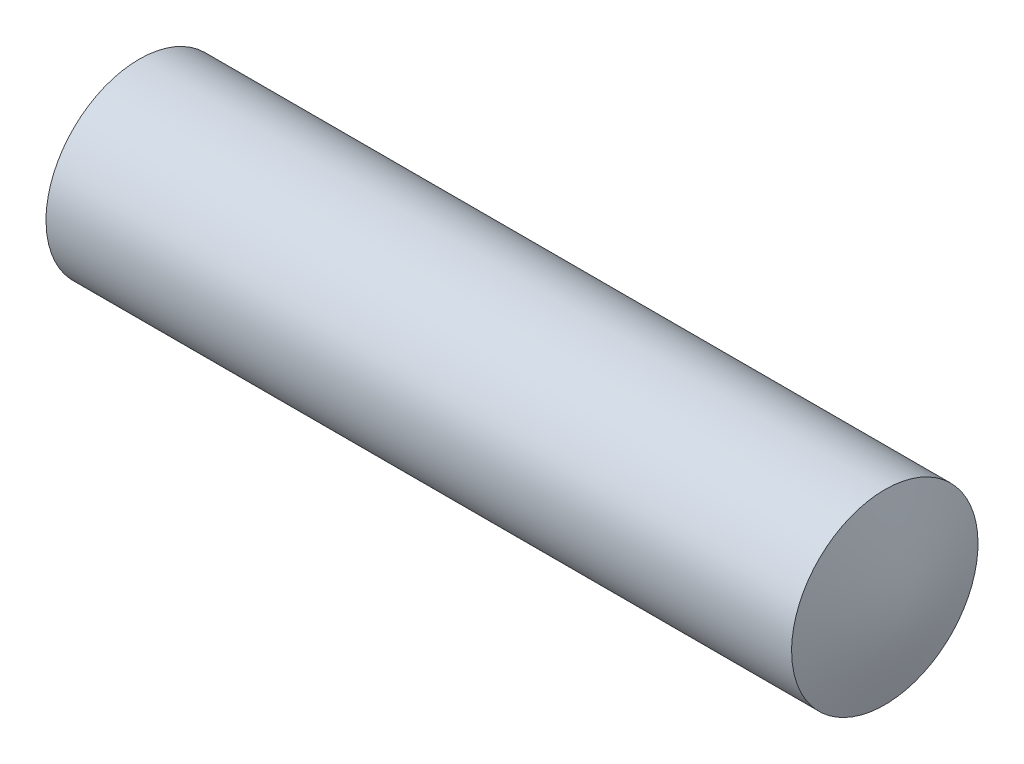
ISO-10303-21;
HEADER;
FILE_DESCRIPTION(('STEP AP214'),'2;1');
FILE_NAME('part.step','',(''),(''),'','','');
FILE_SCHEMA(('AUTOMOTIVE_DESIGN { 1 0 10303 214 1 1 1 1 }'));
ENDSEC;
DATA;
#1=APPLICATION_CONTEXT('core data for automotive mechanical design processes');
#2=APPLICATION_PROTOCOL_DEFINITION('international standard','automotive_design',2000,#1);
#3=PRODUCT_CONTEXT('',#1,'mechanical');
#4=PRODUCT('Part','Part','',(#3));
#5=PRODUCT_RELATED_PRODUCT_CATEGORY('part','',(#4));
#6=PRODUCT_DEFINITION_FORMATION('','',#4);
#7=PRODUCT_DEFINITION_CONTEXT('part definition',#1,'design');
#8=PRODUCT_DEFINITION('design','',#6,#7);
#9=PRODUCT_DEFINITION_SHAPE('','',#8);
#10=(LENGTH_UNIT() NAMED_UNIT(*) SI_UNIT(.MILLI.,.METRE.));
#11=(NAMED_UNIT(*) PLANE_ANGLE_UNIT() SI_UNIT($,.RADIAN.));
#12=(NAMED_UNIT(*) SI_UNIT($,.STERADIAN.) SOLID_ANGLE_UNIT());
#13=UNCERTAINTY_MEASURE_WITH_UNIT(LENGTH_MEASURE(1.E-05),#10,'distance_accuracy_value','');
#14=(GEOMETRIC_REPRESENTATION_CONTEXT(3) GLOBAL_UNCERTAINTY_ASSIGNED_CONTEXT((#13)) GLOBAL_UNIT_ASSIGNED_CONTEXT((#10,
#11,#12)) REPRESENTATION_CONTEXT('',''));
#15=CARTESIAN_POINT('',(0.,0.,0.));
#16=DIRECTION('',(0.,0.,1.));
#17=DIRECTION('',(1.,0.,0.));
#18=AXIS2_PLACEMENT_3D('',#15,#16,#17);
#19=CARTESIAN_POINT('',(12.,0.,0.));
#20=DIRECTION('',(-1.,0.,0.));
#21=DIRECTION('',(0.,0.,1.));
#22=AXIS2_PLACEMENT_3D('',#19,#20,#21);
#23=CYLINDRICAL_SURFACE('',#22,1.5);
#24=CARTESIAN_POINT('',(12.0001059827185,-2.3166701931104E-11,1.5));
#25=CARTESIAN_POINT('',(12.0001064318825,-0.0842556552579519,1.49999626375808));
#26=CARTESIAN_POINT('',(12.0001200074263,-0.168572402661575,1.49287716431795));
#27=CARTESIAN_POINT('',(12.000118282324,-0.334883759961265,1.46457645679987));
#28=CARTESIAN_POINT('',(12.000102946884,-0.416875451132306,1.44337792419635));
#29=CARTESIAN_POINT('',(12.0001029470895,-0.576103212730483,1.3875218228483));
#30=CARTESIAN_POINT('',(12.0001182681021,-0.653341533891657,1.35287068164928));
#31=CARTESIAN_POINT('',(12.0001545482061,-0.80088277753454,1.27110181285513));
#32=CARTESIAN_POINT('',(12.0001755058955,-0.871187418606728,1.22398718519003));
#33=CARTESIAN_POINT('',(12.0001969373426,-1.00289772294532,1.11861924402725));
#34=CARTESIAN_POINT('',(12.0001974089591,-1.06430245539378,1.06036476691778));
#35=CARTESIAN_POINT('',(12.0001785401791,-1.17646253414243,0.934371371444682));
#36=CARTESIAN_POINT('',(12.0001591990045,-1.22721746213628,0.866632080707747));
#37=CARTESIAN_POINT('',(12.0001197457205,-1.3166334185829,0.723595166156088));
#38=CARTESIAN_POINT('',(12.0000996336258,-1.35529467633867,0.648297685684775));
#39=CARTESIAN_POINT('',(12.0001022446447,-1.41942700099795,0.492280945238238));
#40=CARTESIAN_POINT('',(12.0001249676721,-1.44489809444491,0.411561696173971));
#41=CARTESIAN_POINT('',(12.0001511753142,-1.48192720558279,0.246992525677086));
#42=CARTESIAN_POINT('',(12.0001546598979,-1.4934852007852,0.16314259918441));
#43=CARTESIAN_POINT('',(12.0001602554544,-1.50235993023339,-0.00530739730532846));
#44=CARTESIAN_POINT('',(12.0001623664297,-1.49967669016667,-0.0899074659490521));
#45=CARTESIAN_POINT('',(12.000145445424,-1.48014517100489,-0.257456429244504));
#46=CARTESIAN_POINT('',(12.0001264134243,-1.46329687936906,-0.340405322434325));
#47=CARTESIAN_POINT('',(12.0001038153048,-1.41591348629939,-0.502297276486188));
#48=CARTESIAN_POINT('',(12.0001002492012,-1.38537837055217,-0.581240333158914));
#49=CARTESIAN_POINT('',(12.0001217344683,-1.31148814889508,-0.732879515365011));
#50=CARTESIAN_POINT('',(12.0001467858252,-1.26813304914022,-0.805575643897577));
#51=CARTESIAN_POINT('',(12.0001838811954,-1.16983359433255,-0.942657362687674));
#52=CARTESIAN_POINT('',(12.0001959252141,-1.11488924406226,-1.00704295637468));
#53=CARTESIAN_POINT('',(12.0001980967556,-0.994970956685746,-1.12567594992769));
#54=CARTESIAN_POINT('',(12.0001882242685,-0.929997015000458,-1.17992334516502));
#55=CARTESIAN_POINT('',(12.0001534759152,-0.79186397468898,-1.27673998793248));
#56=CARTESIAN_POINT('',(12.0001286000467,-0.71870487484212,-1.31930923372102));
#57=CARTESIAN_POINT('',(12.0001045506413,-0.56627829962824,-1.39156115073635));
#58=CARTESIAN_POINT('',(12.0001053771015,-0.487010824954788,-1.42124382342633));
#59=CARTESIAN_POINT('',(12.0001103293267,-0.324617669968242,-1.46687999424995));
#60=CARTESIAN_POINT('',(12.0001144550916,-0.241491989817691,-1.482833492962));
#61=CARTESIAN_POINT('',(12.0001135510741,-0.0737421166618076,-1.50055844543833));
#62=CARTESIAN_POINT('',(12.0001085212922,0.0108820762611361,-1.50232989998235));
#63=CARTESIAN_POINT('',(12.0001101307981,0.179226752009532,-1.49164047953271));
#64=CARTESIAN_POINT('',(12.0001167700864,0.262947234795836,-1.47917960392251));
#65=CARTESIAN_POINT('',(12.0001125627333,0.427107928078044,-1.44037924497763));
#66=CARTESIAN_POINT('',(12.0001017160883,0.507548137872126,-1.4140397586736));
#67=CARTESIAN_POINT('',(12.0001148007699,0.662864792137111,-1.34822988299196));
#68=CARTESIAN_POINT('',(12.0001387320922,0.737741237315941,-1.3087594952851));
#69=CARTESIAN_POINT('',(12.0001768194986,0.879804823885455,-1.21780828332126));
#70=CARTESIAN_POINT('',(12.0001909755873,0.946991968809414,-1.16632746458316));
#71=CARTESIAN_POINT('',(12.000197255257,1.07176977584983,-1.05281674395769));
#72=CARTESIAN_POINT('',(12.0001893788293,1.12936043414568,-0.990786837870475));
#73=CARTESIAN_POINT('',(12.00015788586,1.23331040664297,-0.857938803777591));
#74=CARTESIAN_POINT('',(12.0001342693176,1.27966972022704,-0.787120675288845));
#75=CARTESIAN_POINT('',(12.0001037479245,1.35984095676549,-0.638706588457513));
#76=CARTESIAN_POINT('',(12.000096843056,1.39365289308153,-0.561110637332718));
#77=CARTESIAN_POINT('',(12.0001158426938,1.44776961558461,-0.401343583524262));
#78=CARTESIAN_POINT('',(12.0001417471919,1.46807440512229,-0.319172481975533));
#79=CARTESIAN_POINT('',(12.0001628973597,1.49460048101546,-0.152587540757091));
#80=CARTESIAN_POINT('',(12.0001581429741,1.50082174194889,-0.0681736970392977));
#81=CARTESIAN_POINT('',(12.0001555195963,1.49900408584573,0.100500201589055));
#82=CARTESIAN_POINT('',(12.0001576505944,1.49096518871357,0.184760256714109));
#83=CARTESIAN_POINT('',(12.0001341263468,1.46085541218667,0.350734972117025));
#84=CARTESIAN_POINT('',(12.0001084710453,1.43878450462693,0.432449627285426));
#85=CARTESIAN_POINT('',(12.0000968828057,1.38123672474372,0.591015206454616));
#86=CARTESIAN_POINT('',(12.0001109506081,1.34575960251996,0.66786603975952));
#87=CARTESIAN_POINT('',(12.0001474881132,1.26240798891117,0.814517788750713));
#88=CARTESIAN_POINT('',(12.0001699574859,1.21453398420443,0.884318981043152));
#89=CARTESIAN_POINT('',(12.0001964494271,1.1077533190652,1.01488655840472));
#90=CARTESIAN_POINT('',(12.0002004739316,1.04884781723405,1.07565389106881));
#91=CARTESIAN_POINT('',(12.0001871038097,0.921653810424114,1.18645206030826));
#92=CARTESIAN_POINT('',(12.0001697038592,0.853362976937675,1.23648022457207));
#93=CARTESIAN_POINT('',(12.0001304961946,0.709324979348611,1.32438024721834));
#94=CARTESIAN_POINT('',(12.0001086863811,0.633574272685011,1.36224629329984));
#95=CARTESIAN_POINT('',(12.0001005727564,0.476850261871239,1.42467985961517));
#96=CARTESIAN_POINT('',(12.0001142262696,0.395883349123361,1.44926332070846));
#97=CARTESIAN_POINT('',(12.0001194844647,0.262000371009961,1.47788194284121));
#98=CARTESIAN_POINT('',(12.0001174385281,0.209954240899939,1.48616586272016));
#99=CARTESIAN_POINT('',(12.0001105473122,0.105280026193528,1.49722605870921));
#100=CARTESIAN_POINT('',(12.0001057020329,0.052651941595459,1.50000233480341));
#101=CARTESIAN_POINT('',(12.0001059827185,-2.3166701931104E-11,1.5));
#102=B_SPLINE_CURVE_WITH_KNOTS('',3,(#24,#25,#26,#27,#28,#29,#30,#31,#32,#33,#34,#35,#36,#37,
#38,#39,#40,#41,#42,#43,#44,#45,#46,#47,#48,#49,#50,#51,#52,#53,#54,#55,#56,#57,#58,#59,#60,#61,
#62,#63,#64,#65,#66,#67,#68,#69,#70,#71,#72,#73,#74,#75,#76,#77,#78,#79,#80,#81,#82,#83,#84,#85,
#86,#87,#88,#89,#90,#91,#92,#93,#94,#95,#96,#97,#98,#99,#100,#101),.UNSPECIFIED.,.T.,.F.,(4,2,2,
2,2,2,2,2,2,2,2,2,2,2,2,2,2,2,2,2,2,2,2,2,2,2,2,2,2,2,2,2,2,2,2,2,2,2,4),(0.,0.252574786765832,
0.505453738045248,0.758212014248185,1.01090748318773,1.26362936183785,1.51636116511979,
1.76908817617,2.02181467863882,2.27454158960286,2.52726804471296,2.77999472357024,
3.03272166672437,3.28544848854183,3.53817520606716,3.79090203897654,4.04362890957565,
4.29635575147925,4.54908258273567,4.80180940009704,5.05453622840629,5.30726311078679,
5.55998996101064,5.81271669510469,6.06544352981549,6.31817037841832,6.57089695789241,
6.82362347467433,7.0763504476506,7.32907706786904,7.58180419536082,7.83453603407801,
8.08725795252233,8.33995334329718,8.59271154154484,8.84559035433524,9.09816500114989,
9.25600073160299,9.41383646251119),.UNSPECIFIED.);
#103=CARTESIAN_POINT('',(12.0001059827185,-2.3166701931104E-11,1.5));
#104=VERTEX_POINT('',#103);
#105=EDGE_CURVE('E12',#104,#104,#102,.T.);
#106=ORIENTED_EDGE('',*,*,#105,.F.);
#107=EDGE_LOOP('',(#106));
#108=FACE_BOUND('',#107,.T.);
#109=CARTESIAN_POINT('',(-0.000105982718356098,2.32235981815125E-11,1.5));
#110=CARTESIAN_POINT('',(-0.000106468263381592,-0.0842556549268096,1.4999962637602));
#111=CARTESIAN_POINT('',(-0.000120080340289708,-0.168572402047688,1.49287716436775));
#112=CARTESIAN_POINT('',(-0.000118187904624471,-0.334883758747322,1.46457645706123));
#113=CARTESIAN_POINT('',(-0.000102648308513269,-0.416875449601755,1.44337792462591));
#114=CARTESIAN_POINT('',(-0.000102299074379299,-0.576103210735653,1.38752182365533));
#115=CARTESIAN_POINT('',(-0.000117474775423849,-0.653341531746734,1.35287068265883));
#116=CARTESIAN_POINT('',(-0.000154078931020456,-0.8008827750548,1.2711018144086));
#117=CARTESIAN_POINT('',(-0.000175505830910784,-0.871187415935465,1.22398718707254));
#118=CARTESIAN_POINT('',(-0.000198506643627144,-1.00289771968125,1.118619246893));
#119=CARTESIAN_POINT('',(-0.000200078481468176,-1.06430245178432,1.06036477050758));
#120=CARTESIAN_POINT('',(-0.000182736204225892,-1.17646253014771,0.934371376396956));
#121=CARTESIAN_POINT('',(-0.000163821284633403,-1.2272174580998,0.866632086296767));
#122=CARTESIAN_POINT('',(-0.000123442163210537,-1.31663341293057,0.723595176066043));
#123=CARTESIAN_POINT('',(-0.000101978009812821,-1.3552946695251,0.648297699537011));
#124=CARTESIAN_POINT('',(-0.000101585815278593,-1.41942699331552,0.492280966650883));
#125=CARTESIAN_POINT('',(-0.000122657688479701,-1.44489808707465,0.411561721212887));
#126=CARTESIAN_POINT('',(-0.000148001592430528,-1.48192720074581,0.246992554890972));
#127=CARTESIAN_POINT('',(-0.000152273595290303,-1.49348519756029,0.163142628809954));
#128=CARTESIAN_POINT('',(-0.000160266043991163,-1.50235993031765,-0.00530736731863429));
#129=CARTESIAN_POINT('',(-0.000163986490827387,-1.49967669195547,-0.0899074360124757));
#130=CARTESIAN_POINT('',(-0.000148492246194484,-1.48014517567577,-0.257456403767534));
#131=CARTESIAN_POINT('',(-0.000129277533284224,-1.46329688451593,-0.340405301285065));
#132=CARTESIAN_POINT('',(-0.000104576280820206,-1.41591349109031,-0.502297263681561));
#133=CARTESIAN_POINT('',(-9.90897556217931E-05,-1.38537837451247,-0.581240324371601));
#134=CARTESIAN_POINT('',(-0.0001179702619388,-1.31148815123953,-0.732879511213532));
#135=CARTESIAN_POINT('',(-0.000142337277875911,-1.26813305123423,-0.805575640625202));
#136=CARTESIAN_POINT('',(-0.000179633850063402,-1.16983359594662,-0.942657360789015));
#137=CARTESIAN_POINT('',(-0.000192563411011391,-1.11488924542429,-1.00704295495446));
#138=CARTESIAN_POINT('',(-0.000196564722241278,-0.994970956251304,-1.12567595043026));
#139=CARTESIAN_POINT('',(-0.000187636462237958,-0.929997012881225,-1.17992334697006));
#140=CARTESIAN_POINT('',(-0.000154014983182949,-0.79186396894335,-1.27673999163987));
#141=CARTESIAN_POINT('',(-0.000129321761784695,-0.718704867157221,-1.31930923803163));
#142=CARTESIAN_POINT('',(-0.000105214807539199,-0.566278291108545,-1.39156115410691));
#143=CARTESIAN_POINT('',(-0.000105801070775193,-0.487010817792422,-1.42124382578705));
#144=CARTESIAN_POINT('',(-0.000110397806314821,-0.324617665732364,-1.46687999509239));
#145=CARTESIAN_POINT('',(-0.000114408278472426,-0.241491987152966,-1.48283349330308));
#146=CARTESIAN_POINT('',(-0.000113481777298522,-0.0737421151617547,-1.50055844553731));
#147=CARTESIAN_POINT('',(-0.000108544804240272,0.0108820782042934,-1.50232989999397));
#148=CARTESIAN_POINT('',(-0.000110203855266434,0.179226754828229,-1.49164047921873));
#149=CARTESIAN_POINT('',(-0.000116799879852461,0.26294723804681,-1.4791796033678));
#150=CARTESIAN_POINT('',(-0.000112295041968568,0.42710793144938,-1.44037924396712));
#151=CARTESIAN_POINT('',(-0.000101194175853733,0.507548140957748,-1.41403975755888));
#152=CARTESIAN_POINT('',(-0.000114050129919581,0.662864794700197,-1.34822988171325));
#153=CARTESIAN_POINT('',(-0.00013800694564823,0.737741239640827,-1.30875949394337));
#154=CARTESIAN_POINT('',(-0.000176890548983523,0.879804824555615,-1.21780828274552));
#155=CARTESIAN_POINT('',(-0.000191817340870576,0.946991968174642,-1.16632746501073));
#156=CARTESIAN_POINT('',(-0.000199921502309663,1.07176977312238,-1.05281674658874));
#157=CARTESIAN_POINT('',(-0.000193098863237337,1.12936043064576,-0.99078684171848));
#158=CARTESIAN_POINT('',(-0.000162444198260389,1.23331040281906,-0.85793880928945));
#159=CARTESIAN_POINT('',(-0.000138612171109801,1.27966971664627,-0.787120681086928));
#160=CARTESIAN_POINT('',(-0.000106056757608647,1.3598409537508,-0.638706594869047));
#161=CARTESIAN_POINT('',(-9.73333551710558E-05,1.39365289038801,-0.561110644070521));
#162=CARTESIAN_POINT('',(-0.000113655183064332,1.44776961482804,-0.401343586972039));
#163=CARTESIAN_POINT('',(-0.000138700406483567,1.46807440539545,-0.319172481608511));
#164=CARTESIAN_POINT('',(-0.00016040430560108,1.49460048205367,-0.152587532888649));
#165=CARTESIAN_POINT('',(-0.00015706293002785,1.50082174270698,-0.0681736854817774));
#166=CARTESIAN_POINT('',(-0.000157099314650237,1.4990040847689,0.100500219608717));
#167=CARTESIAN_POINT('',(-0.000160477065383372,1.49096518625995,0.184760277508753));
#168=CARTESIAN_POINT('',(-0.000137025182041497,1.46085540623142,0.350734997674787));
#169=CARTESIAN_POINT('',(-0.000110195487305441,1.43878449653351,0.432449654828904));
#170=CARTESIAN_POINT('',(-9.5738090012295E-05,1.38123671283647,0.591015234020324));
#171=CARTESIAN_POINT('',(-0.000108111116311,1.34575958960022,0.667866065602437));
#172=CARTESIAN_POINT('',(-0.000142970593673964,1.26240797456327,0.814517810883615));
#173=CARTESIAN_POINT('',(-0.000165456647748383,1.21453396943706,0.884319001186696));
#174=CARTESIAN_POINT('',(-0.000193061307851953,1.10775330541367,1.01488657301091));
#175=CARTESIAN_POINT('',(-0.000198181737093082,1.04884780539525,1.07565390235394));
#176=CARTESIAN_POINT('',(-0.000186578249050967,0.92165380293675,1.18645206585799));
#177=CARTESIAN_POINT('',(-0.000169848902069495,0.853362972003452,1.23648022772409));
#178=CARTESIAN_POINT('',(-0.000131271626740529,0.709324977896895,1.32438024796324));
#179=CARTESIAN_POINT('',(-0.000109421259475111,0.633574271909551,1.36224629361982));
#180=CARTESIAN_POINT('',(-0.000101027812033379,0.476850262465812,1.42467985936727));
#181=CARTESIAN_POINT('',(-0.000114442295408107,0.395883350410151,1.44926332031352));
#182=CARTESIAN_POINT('',(-0.000119491229753124,0.262000372705749,1.47788194255379));
#183=CARTESIAN_POINT('',(-0.000117407867763461,0.209954242276801,1.48616586253776));
#184=CARTESIAN_POINT('',(-0.00011050190184536,0.105280026914708,1.49722605866993));
#185=CARTESIAN_POINT('',(-0.000105679297908951,0.0526519419798703,1.50000233480211));
#186=CARTESIAN_POINT('',(-0.000105982718356098,2.32235981815125E-11,1.5));
#187=B_SPLINE_CURVE_WITH_KNOTS('',3,(#109,#110,#111,#112,#113,#114,#115,#116,#117,#118,#119,
#120,#121,#122,#123,#124,#125,#126,#127,#128,#129,#130,#131,#132,#133,#134,#135,#136,#137,#138,
#139,#140,#141,#142,#143,#144,#145,#146,#147,#148,#149,#150,#151,#152,#153,#154,#155,#156,#157,
#158,#159,#160,#161,#162,#163,#164,#165,#166,#167,#168,#169,#170,#171,#172,#173,#174,#175,#176,
#177,#178,#179,#180,#181,#182,#183,#184,#185,#186),.UNSPECIFIED.,.T.,.F.,(4,2,2,2,2,2,2,2,2,2,2,
2,2,2,2,2,2,2,2,2,2,2,2,2,2,2,2,2,2,2,2,2,2,2,2,2,2,2,4),(0.,0.252574785900327,
0.505453736238522,0.758212011627218,1.01090748000226,1.26362935650273,1.51636115767969,
1.76908815799607,2.02181464935155,2.27454156026531,2.52726801519358,2.77999470638553,
3.03272166184961,3.28544848543463,3.53817520521927,3.79090204392472,4.04362892024775,
4.29635575741368,4.54908258380187,4.80180940247165,5.05453623213346,5.30726311384781,
5.55998996346796,5.81271669329047,6.06544352332739,6.31817037187698,6.57089695133352,
6.82362347906298,7.0763504632639,7.32907709155208,7.58180422735384,7.83453606187838,
8.08725797620723,8.33995335651314,8.59271154390391,8.84559035446139,9.0981649991177,
9.2560007305724,9.41383646248645),.UNSPECIFIED.);
#188=CARTESIAN_POINT('',(-0.000105982718356098,2.32235981815125E-11,1.5));
#189=VERTEX_POINT('',#188);
#190=EDGE_CURVE('E137',#189,#189,#187,.T.);
#191=ORIENTED_EDGE('',*,*,#190,.T.);
#192=EDGE_LOOP('',(#191));
#193=FACE_BOUND('',#192,.T.);
#194=ADVANCED_FACE('F123',(#108,#193),#23,.T.);
#195=CARTESIAN_POINT('',(11.8033901567117,-1.52998606169543,-1.59548793655052));
#196=CARTESIAN_POINT('',(11.8507874924583,-1.52998606169543,-1.34021049039008));
#197=CARTESIAN_POINT('',(11.8939065515164,-1.52998606169543,-1.08493304422964));
#198=CARTESIAN_POINT('',(11.9340998152935,-1.52998606169543,-0.8296555980692));
#199=CARTESIAN_POINT('',(11.9801912396677,-1.52998606169543,-0.446738909147258));
#200=CARTESIAN_POINT('',(11.9929240980353,-1.52998606169543,-0.0638222202253154));
#201=CARTESIAN_POINT('',(11.9929256141974,-1.52998606169544,0.0638170225361882));
#202=CARTESIAN_POINT('',(11.9801995088577,-1.52998606169544,0.446734750820699));
#203=CARTESIAN_POINT('',(11.9340950420421,-1.52998606169543,0.82965247910521));
#204=CARTESIAN_POINT('',(11.8938926453803,-1.52998606169543,1.08493096462822));
#205=CARTESIAN_POINT('',(11.8507784312655,-1.52998606169543,1.34020945015122));
#206=CARTESIAN_POINT('',(11.8033846085844,-1.52998606169543,1.59548793567423));
#207=CARTESIAN_POINT('',(11.845755523366,-1.2851888898442,-1.59548793655052));
#208=CARTESIAN_POINT('',(11.9006092808553,-1.2851888898442,-1.34021049039008));
#209=CARTESIAN_POINT('',(11.9511217303888,-1.2851888898442,-1.08493304422964));
#210=CARTESIAN_POINT('',(11.9990209182289,-1.2851888898442,-0.8296555980692));
#211=CARTESIAN_POINT('',(12.0542978970554,-1.2851888898442,-0.446738909147258));
#212=CARTESIAN_POINT('',(12.0696007200402,-1.2851888898442,-0.0638222202253153));
#213=CARTESIAN_POINT('',(12.0696013072204,-1.2851888898442,0.0638170225361883));
#214=CARTESIAN_POINT('',(12.0543017530439,-1.2851888898442,0.446734750820699));
#215=CARTESIAN_POINT('',(11.9990122008694,-1.2851888898442,0.82965247910521));
#216=CARTESIAN_POINT('',(11.9511145554032,-1.2851888898442,1.08493096462822));
#217=CARTESIAN_POINT('',(11.9006061461928,-1.2851888898442,1.34020945015122));
#218=CARTESIAN_POINT('',(11.845755553712,-1.2851888898442,1.59548793567423));
#219=CARTESIAN_POINT('',(11.884193504468,-1.04039171799296,-1.59548793655052));
#220=CARTESIAN_POINT('',(11.9464440338911,-1.04039171799296,-1.34021049039008));
#221=CARTESIAN_POINT('',(12.0042280361642,-1.04039171799296,-1.08493304422964));
#222=CARTESIAN_POINT('',(12.0601048088876,-1.04039171799296,-0.8296555980692));
#223=CARTESIAN_POINT('',(12.1248639649365,-1.04039171799296,-0.446738909147258));
#224=CARTESIAN_POINT('',(12.1428225327074,-1.04039171799296,-0.0638222202253153));
#225=CARTESIAN_POINT('',(12.1428230826577,-1.04039171799296,0.0638170225361883));
#226=CARTESIAN_POINT('',(12.1248613441893,-1.04039171799296,0.446734750820699));
#227=CARTESIAN_POINT('',(12.0600968685364,-1.04039171799296,0.82965247910521));
#228=CARTESIAN_POINT('',(12.0042311933115,-1.04039171799296,1.08493096462822));
#229=CARTESIAN_POINT('',(11.9464457216828,-1.04039171799296,1.34020945015122));
#230=CARTESIAN_POINT('',(11.8841975747089,-1.04039171799296,1.59548793567423));
#231=CARTESIAN_POINT('',(11.9199001165165,-0.79559454614172,-1.59548793655052));
#232=CARTESIAN_POINT('',(11.9898792798668,-0.79559454614172,-1.34021049039008));
#233=CARTESIAN_POINT('',(12.0556175098634,-0.79559454614172,-1.08493304422964));
#234=CARTESIAN_POINT('',(12.1201842309555,-0.79559454614172,-0.8296555980692));
#235=CARTESIAN_POINT('',(12.1938571551987,-0.795594546141721,-0.446738909147258));
#236=CARTESIAN_POINT('',(12.2145234211836,-0.795594546141721,-0.0638222202253153));
#237=CARTESIAN_POINT('',(12.2145231487078,-0.795594546141721,0.0638170225361883));
#238=CARTESIAN_POINT('',(12.1938558890335,-0.795594546141721,0.446734750820699));
#239=CARTESIAN_POINT('',(12.1201864818886,-0.79559454614172,0.82965247910521));
#240=CARTESIAN_POINT('',(12.0556183516298,-0.79559454614172,1.08493096462822));
#241=CARTESIAN_POINT('',(11.9898808713694,-0.79559454614172,1.34020945015122));
#242=CARTESIAN_POINT('',(11.9199021009081,-0.79559454614172,1.59548793567423));
#243=CARTESIAN_POINT('',(11.9605240175338,-0.4283982900148,-1.59548793655052));
#244=CARTESIAN_POINT('',(12.0398325367382,-0.4283982900148,-1.34021049039008));
#245=CARTESIAN_POINT('',(12.1152483085778,-0.4283982900148,-1.08493304422964));
#246=CARTESIAN_POINT('',(12.1888661639323,-0.4283982900148,-0.8296555980692));
#247=CARTESIAN_POINT('',(12.2795144311948,-0.428398290014801,-0.446738909147258));
#248=CARTESIAN_POINT('',(12.3053547203178,-0.428398290014801,-0.0638222202253153));
#249=CARTESIAN_POINT('',(12.3053548296069,-0.428398290014801,0.0638170225361883));
#250=CARTESIAN_POINT('',(12.2795155101332,-0.428398290014801,0.446734750820699));
#251=CARTESIAN_POINT('',(12.1888666803469,-0.4283982900148,0.82965247910521));
#252=CARTESIAN_POINT('',(12.1152492721626,-0.4283982900148,1.08493096462822));
#253=CARTESIAN_POINT('',(12.0398326174497,-0.4283982900148,1.34020945015122));
#254=CARTESIAN_POINT('',(11.9605238291195,-0.4283982900148,1.59548793567423));
#255=CARTESIAN_POINT('',(11.9716476972195,-0.0612020338878795,-1.59548793655052));
#256=CARTESIAN_POINT('',(12.0535906423927,-0.0612020338878797,-1.34021049039008));
#257=CARTESIAN_POINT('',(12.1317858649904,-0.0612020338878799,-1.08493304422964));
#258=CARTESIAN_POINT('',(12.208171248917,-0.0612020338878801,-0.8296555980692));
#259=CARTESIAN_POINT('',(12.3040084125708,-0.0612020338878803,-0.446738909147258));
#260=CARTESIAN_POINT('',(12.3336635831969,-0.0612020338878803,-0.0638222202253153));
#261=CARTESIAN_POINT('',(12.333663766226,-0.0612020338878803,0.0638170225361883));
#262=CARTESIAN_POINT('',(12.3040092804464,-0.0612020338878803,0.446734750820699));
#263=CARTESIAN_POINT('',(12.2081723015664,-0.0612020338878801,0.82965247910521));
#264=CARTESIAN_POINT('',(12.1317863566223,-0.0612020338878799,1.08493096462822));
#265=CARTESIAN_POINT('',(12.053590916831,-0.0612020338878797,1.34020945015122));
#266=CARTESIAN_POINT('',(11.9716475863873,-0.0612020338878795,1.59548793567423));
#267=CARTESIAN_POINT('',(11.9716476331157,0.0611970503878023,-1.59548793655052));
#268=CARTESIAN_POINT('',(12.0535906520546,0.0611970503878021,-1.34021049039008));
#269=CARTESIAN_POINT('',(12.1317858157981,0.061197050387802,-1.08493304422964));
#270=CARTESIAN_POINT('',(12.2081714540318,0.0611970503878018,-0.8296555980692));
#271=CARTESIAN_POINT('',(12.3040084611393,0.0611970503878016,-0.446738909147258));
#272=CARTESIAN_POINT('',(12.3336637586729,0.0611970503878015,-0.0638222202253153));
#273=CARTESIAN_POINT('',(12.3336639244239,0.0611970503878015,0.0638170225361883));
#274=CARTESIAN_POINT('',(12.3040094944262,0.0611970503878016,0.446734750820699));
#275=CARTESIAN_POINT('',(12.2081723079539,0.0611970503878018,0.82965247910521));
#276=CARTESIAN_POINT('',(12.1317865919873,0.061197050387802,1.08493096462822));
#277=CARTESIAN_POINT('',(12.0535910410838,0.0611970503878022,1.34020945015122));
#278=CARTESIAN_POINT('',(11.9716477460547,0.0611970503878023,1.59548793567423));
#279=CARTESIAN_POINT('',(11.9605241852634,0.428394303214848,-1.59548793655052));
#280=CARTESIAN_POINT('',(12.0398327557083,0.428394303214848,-1.34021049039008));
#281=CARTESIAN_POINT('',(12.1152492217613,0.428394303214848,-1.08493304422964));
#282=CARTESIAN_POINT('',(12.1888664024306,0.428394303214847,-0.8296555980692));
#283=CARTESIAN_POINT('',(12.2795154621096,0.428394303214847,-0.446738909147258));
#284=CARTESIAN_POINT('',(12.3053555956137,0.428394303214847,-0.0638222202253153));
#285=CARTESIAN_POINT('',(12.3053557621762,0.428394303214847,0.0638170225361883));
#286=CARTESIAN_POINT('',(12.2795161494095,0.428394303214847,0.446734750820699));
#287=CARTESIAN_POINT('',(12.1888677333891,0.428394303214847,0.82965247910521));
#288=CARTESIAN_POINT('',(12.11524947614,0.428394303214848,1.08493096462822));
#289=CARTESIAN_POINT('',(12.0398333183735,0.428394303214848,1.34020945015122));
#290=CARTESIAN_POINT('',(11.9605243774569,0.428394303214848,1.59548793567423));
#291=CARTESIAN_POINT('',(11.9199025487107,0.795591556041894,-1.59548793655052));
#292=CARTESIAN_POINT('',(11.9898811346186,0.795591556041893,-1.34021049039008));
#293=CARTESIAN_POINT('',(12.055618462185,0.795591556041893,-1.08493304422964));
#294=CARTESIAN_POINT('',(12.1201864241386,0.795591556041893,-0.8296555980692));
#295=CARTESIAN_POINT('',(12.1938560646648,0.795591556041893,-0.446738909147258));
#296=CARTESIAN_POINT('',(12.2145239290274,0.795591556041893,-0.0638222202253153));
#297=CARTESIAN_POINT('',(12.21452443229,0.795591556041893,0.0638170225361883));
#298=CARTESIAN_POINT('',(12.1938587146489,0.795591556041893,0.446734750820699));
#299=CARTESIAN_POINT('',(12.1201857860742,0.795591556041893,0.82965247910521));
#300=CARTESIAN_POINT('',(12.0556186852032,0.795591556041893,1.08493096462822));
#301=CARTESIAN_POINT('',(11.9898801114655,0.795591556041893,1.34020945015122));
#302=CARTESIAN_POINT('',(11.9199005704872,0.795591556041894,1.59548793567423));
#303=CARTESIAN_POINT('',(11.8841978782244,1.04038972459326,-1.59548793655052));
#304=CARTESIAN_POINT('',(11.9464458370256,1.04038972459326,-1.34021049039008));
#305=CARTESIAN_POINT('',(12.0042311542524,1.04038972459326,-1.08493304422964));
#306=CARTESIAN_POINT('',(12.0600966692157,1.04038972459326,-0.8296555980692));
#307=CARTESIAN_POINT('',(12.1248612994587,1.04038972459326,-0.446738909147258));
#308=CARTESIAN_POINT('',(12.142823579536,1.04038972459326,-0.0638222202253153));
#309=CARTESIAN_POINT('',(12.1428232220305,1.04038972459326,0.0638170225361883));
#310=CARTESIAN_POINT('',(12.1248651464514,1.04038972459326,0.446734750820699));
#311=CARTESIAN_POINT('',(12.0601059984649,1.04038972459326,0.82965247910521));
#312=CARTESIAN_POINT('',(12.0042289289612,1.04038972459326,1.08493096462822));
#313=CARTESIAN_POINT('',(11.9464446494324,1.04038972459326,1.34020945015122));
#314=CARTESIAN_POINT('',(11.8841938101726,1.04038972459326,1.59548793567423));
#315=CARTESIAN_POINT('',(11.8457557221659,1.28518789314462,-1.59548793655052));
#316=CARTESIAN_POINT('',(11.9006061271931,1.28518789314462,-1.34021049039008));
#317=CARTESIAN_POINT('',(11.9511143826789,1.28518789314462,-1.08493304422964));
#318=CARTESIAN_POINT('',(11.999011866671,1.28518789314462,-0.8296555980692));
#319=CARTESIAN_POINT('',(12.0543015326378,1.28518789314462,-0.446738909147258));
#320=CARTESIAN_POINT('',(12.0696015331613,1.28518789314462,-0.0638222202253153));
#321=CARTESIAN_POINT('',(12.0696011137399,1.28518789314462,0.0638170225361883));
#322=CARTESIAN_POINT('',(12.0542987175737,1.28518789314462,0.446734750820699));
#323=CARTESIAN_POINT('',(11.9990217779703,1.28518789314462,0.82965247910521));
#324=CARTESIAN_POINT('',(11.9511223622785,1.28518789314462,1.08493096462822));
#325=CARTESIAN_POINT('',(11.9006096964735,1.28518789314462,1.34020945015122));
#326=CARTESIAN_POINT('',(11.8457556873233,1.28518789314462,1.59548793567423));
#327=CARTESIAN_POINT('',(11.8033846119945,1.52998606169598,-1.59548793655052));
#328=CARTESIAN_POINT('',(11.8507782467675,1.52998606169598,-1.34021049039008));
#329=CARTESIAN_POINT('',(11.8938923049701,1.52998606169598,-1.08493304422964));
#330=CARTESIAN_POINT('',(11.9340945442334,1.52998606169598,-0.8296555980692));
#331=CARTESIAN_POINT('',(11.9801990749302,1.52998606169598,-0.446738909147258));
#332=CARTESIAN_POINT('',(11.9929255447442,1.52998606169598,-0.0638222202253154));
#333=CARTESIAN_POINT('',(11.9929241680358,1.52998606169598,0.0638170225361882));
#334=CARTESIAN_POINT('',(11.9801916755613,1.52998606169598,0.446734750820699));
#335=CARTESIAN_POINT('',(11.9341003173588,1.52998606169598,0.82965247910521));
#336=CARTESIAN_POINT('',(11.8939068934055,1.52998606169598,1.08493096462822));
#337=CARTESIAN_POINT('',(11.8507876755152,1.52998606169598,1.34020945015122));
#338=CARTESIAN_POINT('',(11.8033901486848,1.52998606169598,1.59548793567423));
#339=B_SPLINE_SURFACE_WITH_KNOTS('',5,5,((#195,#196,#197,#198,#199,#200,#201,#202,#203,#204,
#205,#206),(#207,#208,#209,#210,#211,#212,#213,#214,#215,#216,#217,#218),(#219,#220,#221,#222,
#223,#224,#225,#226,#227,#228,#229,#230),(#231,#232,#233,#234,#235,#236,#237,#238,#239,#240,
#241,#242),(#243,#244,#245,#246,#247,#248,#249,#250,#251,#252,#253,#254),(#255,#256,#257,#258,
#259,#260,#261,#262,#263,#264,#265,#266),(#267,#268,#269,#270,#271,#272,#273,#274,#275,#276,
#277,#278),(#279,#280,#281,#282,#283,#284,#285,#286,#287,#288,#289,#290),(#291,#292,#293,#294,
#295,#296,#297,#298,#299,#300,#301,#302),(#303,#304,#305,#306,#307,#308,#309,#310,#311,#312,
#313,#314),(#315,#316,#317,#318,#319,#320,#321,#322,#323,#324,#325,#326),(#327,#328,#329,#330,
#331,#332,#333,#334,#335,#336,#337,#338)),.UNSPECIFIED.,.F.,.F.,.F.,(6,3,3,6),(6,3,3,6),
(-1.5299860617525,-0.30600020249631,0.305995218882099,1.52998606163892),(-1.59548793654444,
-0.319100705742244,0.319095508065273,1.59548793568031),.UNSPECIFIED.);
#340=ORIENTED_EDGE('',*,*,#105,.T.);
#341=EDGE_LOOP('',(#340));
#342=FACE_BOUND('',#341,.T.);
#343=ADVANCED_FACE('F125',(#342),#339,.T.);
#344=CARTESIAN_POINT('',(0.196615383771602,-1.52998606169598,-1.59548793666457));
#345=CARTESIAN_POINT('',(0.149221752170054,-1.52998606169598,-1.34021049049492));
#346=CARTESIAN_POINT('',(0.10610769694101,-1.52998606169598,-1.08493304432527));
#347=CARTESIAN_POINT('',(0.0659054589544708,-1.52998606169598,-0.829655598155612));
#348=CARTESIAN_POINT('',(0.0198009261991451,-1.52998606169598,-0.446738909219849));
#349=CARTESIAN_POINT('',(0.00707445543049614,-1.52998606169598,-0.0638222202840859));
#350=CARTESIAN_POINT('',(0.00707583213321569,-1.52998606169598,0.0638170224820243));
#351=CARTESIAN_POINT('',(0.0198083255299186,-1.52998606169598,0.446734750780355));
#352=CARTESIAN_POINT('',(0.0658996858137989,-1.52998606169598,0.829652479078686));
#353=CARTESIAN_POINT('',(0.106093108520311,-1.52998606169598,1.08493096461091));
#354=CARTESIAN_POINT('',(0.149212323432867,-1.52998606169598,1.34020945014313));
#355=CARTESIAN_POINT('',(0.196609847093538,-1.52998606169598,1.59548793567535));
#356=CARTESIAN_POINT('',(0.154244441960128,-1.2851888898292,-1.59548793666457));
#357=CARTESIAN_POINT('',(0.0993940702769272,-1.2851888898292,-1.34021049049492));
#358=CARTESIAN_POINT('',(0.0488858473672012,-1.2851888898292,-1.08493304432526));
#359=CARTESIAN_POINT('',(0.000988396785534154,-1.2851888898292,-0.829655598155612));
#360=CARTESIAN_POINT('',(-0.0543012327503099,-1.2851888898292,-0.446738909219849));
#361=CARTESIAN_POINT('',(-0.0696012236009736,-1.2851888898292,-0.0638222202840856));
#362=CARTESIAN_POINT('',(-0.0696008041798829,-1.2851888898292,0.0638170224820247));
#363=CARTESIAN_POINT('',(-0.0542984176997309,-1.2851888898292,0.446734750780356));
#364=CARTESIAN_POINT('',(0.000978485496170505,-1.2851888898292,0.829652479078686));
#365=CARTESIAN_POINT('',(0.0488778677301491,-1.2851888898292,1.08493096461091));
#366=CARTESIAN_POINT('',(0.0993905009622115,-1.2851888898292,1.34020945014313));
#367=CARTESIAN_POINT('',(0.154244476769215,-1.2851888898292,1.59548793567535));
#368=CARTESIAN_POINT('',(0.115802425247766,-1.04039171796242,-1.59548793666457));
#369=CARTESIAN_POINT('',(0.0535545275316092,-1.04039171796242,-1.34021049049492));
#370=CARTESIAN_POINT('',(-0.0042307264599726,-1.04039171796242,-1.08493304432526));
#371=CARTESIAN_POINT('',(-0.0600961749126721,-1.04039171796242,-0.829655598155612));
#372=CARTESIAN_POINT('',(-0.124860730639233,-1.04039171796242,-0.446738909219849));
#373=CARTESIAN_POINT('',(-0.142822986888741,-1.04039171796242,-0.0638222202840856));
#374=CARTESIAN_POINT('',(-0.142822629384078,-1.04039171796242,0.0638170224820247));
#375=CARTESIAN_POINT('',(-0.124864577578937,-1.04039171796242,0.446734750780356));
#376=CARTESIAN_POINT('',(-0.0601055042158336,-1.04039171796242,0.829652479078686));
#377=CARTESIAN_POINT('',(-0.00422850127105563,-1.04039171796242,1.08493096461091));
#378=CARTESIAN_POINT('',(0.0535557150525145,-1.04039171796242,1.34020945014313));
#379=CARTESIAN_POINT('',(0.115806493239009,-1.04039171796242,1.59548793567535));
#380=CARTESIAN_POINT('',(0.0800978947719075,-0.795594546095635,-1.59548793666457));
#381=CARTESIAN_POINT('',(0.010119406311959,-0.795594546095635,-1.34021049049492));
#382=CARTESIAN_POINT('',(-0.055617823780457,-0.795594546095635,-1.08493304432526));
#383=CARTESIAN_POINT('',(-0.120185673548026,-0.795594546095635,-0.829655598155612));
#384=CARTESIAN_POINT('',(-0.193855197958572,-0.795594546095634,-0.446738909219849));
#385=CARTESIAN_POINT('',(-0.214523033274908,-0.795594546095634,-0.0638222202840856));
#386=CARTESIAN_POINT('',(-0.214523536534153,-0.795594546095634,0.0638170224820247));
#387=CARTESIAN_POINT('',(-0.193857847985352,-0.795594546095634,0.446734750780356));
#388=CARTESIAN_POINT('',(-0.120185035561573,-0.795594546095635,0.829652479078686));
#389=CARTESIAN_POINT('',(-0.0556180468118339,-0.795594546095635,1.08493096461091));
#390=CARTESIAN_POINT('',(0.0101204294459015,-0.795594546095635,1.34020945014313));
#391=CARTESIAN_POINT('',(0.0800998729973564,-0.795594546095635,1.59548793567535));
#392=CARTESIAN_POINT('',(0.0394761964449936,-0.428398289958353,-1.59548793666457));
#393=CARTESIAN_POINT('',(-0.0398322862079347,-0.428398289958353,-1.34021049049492));
#394=CARTESIAN_POINT('',(-0.115248657072992,-0.428398289958353,-1.08493304432526));
#395=CARTESIAN_POINT('',(-0.188865757436602,-0.428398289958353,-0.829655598155612));
#396=CARTESIAN_POINT('',(-0.279514625784064,-0.428398289958353,-0.446738909219849));
#397=CARTESIAN_POINT('',(-0.305354691910894,-0.428398289958353,-0.0638222202840856));
#398=CARTESIAN_POINT('',(-0.305354858481948,-0.428398289958353,0.0638170224820247));
#399=CARTESIAN_POINT('',(-0.279515313118361,-0.428398289958353,0.446734750780356));
#400=CARTESIAN_POINT('',(-0.188867088433698,-0.428398289958353,0.829652479078686));
#401=CARTESIAN_POINT('',(-0.115248911498548,-0.428398289958353,1.08493096461091));
#402=CARTESIAN_POINT('',(-0.0398328489042186,-0.428398289958353,1.34020945014313));
#403=CARTESIAN_POINT('',(0.0394760042352485,-0.428398289958353,1.59548793567535));
#404=CARTESIAN_POINT('',(0.0283524276053545,-0.061202033821072,-1.59548793666457));
#405=CARTESIAN_POINT('',(-0.0535905767150305,-0.0612020338210719,-1.34021049049492));
#406=CARTESIAN_POINT('',(-0.131785727109941,-0.0612020338210718,-1.08493304432526));
#407=CARTESIAN_POINT('',(-0.208171346145526,-0.0612020338210717,-0.829655598155612));
#408=CARTESIAN_POINT('',(-0.304008330558229,-0.0612020338210716,-0.446738909219849));
#409=CARTESIAN_POINT('',(-0.333663591680952,-0.0612020338210716,-0.0638222202840856));
#410=CARTESIAN_POINT('',(-0.333663757436761,-0.0612020338210716,0.0638170224820247));
#411=CARTESIAN_POINT('',(-0.304009363879175,-0.0612020338210716,0.446734750780356));
#412=CARTESIAN_POINT('',(-0.20817220011406,-0.0612020338210717,0.829652479078686));
#413=CARTESIAN_POINT('',(-0.131786503348781,-0.0612020338210718,1.08493096461091));
#414=CARTESIAN_POINT('',(-0.0535909657923531,-0.0612020338210719,1.34020945014313));
#415=CARTESIAN_POINT('',(0.0283523146296122,-0.061202033821072,1.59548793567535));
#416=CARTESIAN_POINT('',(0.0283522421338114,0.0611970504494274,-1.59548793666457));
#417=CARTESIAN_POINT('',(-0.0535907176532193,0.0611970504494275,-1.34021049049492));
#418=CARTESIAN_POINT('',(-0.131785953605621,0.0611970504494275,-1.08493304432526));
#419=CARTESIAN_POINT('',(-0.20817135674195,0.0611970504494276,-0.829655598155612));
#420=CARTESIAN_POINT('',(-0.304008543114043,0.0611970504494277,-0.446738909219849));
#421=CARTESIAN_POINT('',(-0.3336637501835,0.0611970504494278,-0.0638222202840856));
#422=CARTESIAN_POINT('',(-0.333663933218369,0.0611970504494278,0.0638170224820247));
#423=CARTESIAN_POINT('',(-0.304009411024189,0.0611970504494277,0.446734750780356));
#424=CARTESIAN_POINT('',(-0.208172409438176,0.0611970504494276,0.829652479078686));
#425=CARTESIAN_POINT('',(-0.131786445287439,0.0611970504494275,1.08493096461091));
#426=CARTESIAN_POINT('',(-0.0535909921396598,0.0611970504494275,1.34020945014313));
#427=CARTESIAN_POINT('',(0.028352352929312,0.0611970504494274,1.59548793567535));
#428=CARTESIAN_POINT('',(0.0394756008080579,0.428394303260926,-1.59548793666457));
#429=CARTESIAN_POINT('',(-0.0398330061792076,0.428394303260926,-1.34021049049492));
#430=CARTESIAN_POINT('',(-0.115248873197008,0.428394303260926,-1.08493304432526));
#431=CARTESIAN_POINT('',(-0.188866808874162,0.428394303260926,-0.829655598155612));
#432=CARTESIAN_POINT('',(-0.279515267481896,0.428394303260926,-0.446738909219849));
#433=CARTESIAN_POINT('',(-0.305355624013478,0.428394303260926,-0.0638222202840856));
#434=CARTESIAN_POINT('',(-0.305355733311608,0.428394303260926,0.0638170224820247));
#435=CARTESIAN_POINT('',(-0.279516346459528,0.428394303260926,0.446734750780356));
#436=CARTESIAN_POINT('',(-0.188867325329116,0.428394303260926,0.829652479078686));
#437=CARTESIAN_POINT('',(-0.115249836830386,0.428394303260926,1.08493096461091));
#438=CARTESIAN_POINT('',(-0.0398330869225072,0.428394303260926,1.34020945014313));
#439=CARTESIAN_POINT('',(0.0394757892061795,0.428394303260926,1.59548793567535));
#440=CARTESIAN_POINT('',(0.0800994400282254,0.795591556072424,-1.59548793666457));
#441=CARTESIAN_POINT('',(0.010120179245802,0.795591556072424,-1.34021049049492));
#442=CARTESIAN_POINT('',(-0.0556181482371782,0.795591556072424,-1.08493304432526));
#443=CARTESIAN_POINT('',(-0.12018498145697,0.795591556072424,-0.829655598155612));
#444=CARTESIAN_POINT('',(-0.193858021860857,0.795591556072424,-0.446738909219849));
#445=CARTESIAN_POINT('',(-0.214524316941178,0.795591556072424,-0.0638222202840856));
#446=CARTESIAN_POINT('',(-0.214524044462515,0.795591556072424,0.0638170224820247));
#447=CARTESIAN_POINT('',(-0.193856755739974,0.795591556072424,0.446734750780356));
#448=CARTESIAN_POINT('',(-0.120187232471135,0.795591556072424,0.829652479078686));
#449=CARTESIAN_POINT('',(-0.0556189900181874,0.795591556072424,1.08493096461091));
#450=CARTESIAN_POINT('',(0.0101185877229631,0.795591556072424,1.34020945014313));
#451=CARTESIAN_POINT('',(0.0800974556383082,0.795591556072424,1.59548793567535));
#452=CARTESIAN_POINT('',(0.115806192145824,1.04038972461342,-1.59548793666457));
#453=CARTESIAN_POINT('',(0.0535556016446448,1.04038972461342,-1.34021049049492));
#454=CARTESIAN_POINT('',(-0.00422846383843332,1.04038972461342,-1.08493304432526));
#455=CARTESIAN_POINT('',(-0.0601053031265914,1.04038972461342,-0.829655598155612));
#456=CARTESIAN_POINT('',(-0.124864533806108,1.04038972461342,-0.446738909219849));
#457=CARTESIAN_POINT('',(-0.142823125353868,1.04038972461342,-0.0638222202840856));
#458=CARTESIAN_POINT('',(-0.142823675305104,1.04038972461342,0.0638170224820247));
#459=CARTESIAN_POINT('',(-0.124861913007589,1.04038972461342,0.446734750780356));
#460=CARTESIAN_POINT('',(-0.0600973628306414,1.04038972461342,0.829652479078686));
#461=CARTESIAN_POINT('',(-0.00423162108928909,1.04038972461342,1.08493096461091));
#462=CARTESIAN_POINT('',(0.0535539137801067,1.04038972461342,1.34020945014313));
#463=CARTESIAN_POINT('',(0.115802121844255,1.04038972461342,1.59548793567535));
#464=CARTESIAN_POINT('',(0.154244312562321,1.28518789315442,-1.59548793666457));
#465=CARTESIAN_POINT('',(0.0993905217259319,1.28518789315442,-1.34021049049492));
#466=CARTESIAN_POINT('',(0.0488780396152724,1.28518789315442,-1.08493304432527));
#467=CARTESIAN_POINT('',(0.00097881831271972,1.28518789315442,-0.829655598155612));
#468=CARTESIAN_POINT('',(-0.0542981969270914,1.28518789315442,-0.446738909219849));
#469=CARTESIAN_POINT('',(-0.0696010295998807,1.28518789315442,-0.0638222202840857));
#470=CARTESIAN_POINT('',(-0.0696016167804744,1.28518789315442,0.0638170224820246));
#471=CARTESIAN_POINT('',(-0.0543020529297166,1.28518789315442,0.446734750780355));
#472=CARTESIAN_POINT('',(0.000987535681356866,1.28518789315442,0.829652479078686));
#473=CARTESIAN_POINT('',(0.0488852145629678,1.28518789315442,1.08493096461091));
#474=CARTESIAN_POINT('',(0.0993936563538847,1.28518789315442,1.34020945014313));
#475=CARTESIAN_POINT('',(0.15424428218279,1.28518789315442,1.59548793567535));
#476=CARTESIAN_POINT('',(0.196609847525453,1.52998606169542,-1.59548793666457));
#477=CARTESIAN_POINT('',(0.149212508606018,1.52998606169542,-1.34021049049492));
#478=CARTESIAN_POINT('',(0.106093446566702,1.52998606169542,-1.08493304432527));
#479=CARTESIAN_POINT('',(0.0659001815391875,1.52998606169542,-0.829655598155612));
#480=CARTESIAN_POINT('',(0.0198087592418738,1.52998606169542,-0.446738909219849));
#481=CARTESIAN_POINT('',(0.00707590179524873,1.52998606169542,-0.0638222202840859));
#482=CARTESIAN_POINT('',(0.00707438562742902,1.52998606169542,0.0638170224820243));
#483=CARTESIAN_POINT('',(0.0198004900138397,1.52998606169542,0.446734750780355));
#484=CARTESIAN_POINT('',(0.0659049547752767,1.52998606169542,0.829652479078686));
#485=CARTESIAN_POINT('',(0.106107352717518,1.52998606169542,1.08493096461091));
#486=CARTESIAN_POINT('',(0.149221569809289,1.52998606169542,1.34020945014313));
#487=CARTESIAN_POINT('',(0.196615395664946,1.52998606169542,1.59548793567535));
#488=B_SPLINE_SURFACE_WITH_KNOTS('',5,5,((#344,#345,#346,#347,#348,#349,#350,#351,#352,#353,
#354,#355),(#356,#357,#358,#359,#360,#361,#362,#363,#364,#365,#366,#367),(#368,#369,#370,#371,
#372,#373,#374,#375,#376,#377,#378,#379),(#380,#381,#382,#383,#384,#385,#386,#387,#388,#389,
#390,#391),(#392,#393,#394,#395,#396,#397,#398,#399,#400,#401,#402,#403),(#404,#405,#406,#407,
#408,#409,#410,#411,#412,#413,#414,#415),(#416,#417,#418,#419,#420,#421,#422,#423,#424,#425,
#426,#427),(#428,#429,#430,#431,#432,#433,#434,#435,#436,#437,#438,#439),(#440,#441,#442,#443,
#444,#445,#446,#447,#448,#449,#450,#451),(#452,#453,#454,#455,#456,#457,#458,#459,#460,#461,
#462,#463),(#464,#465,#466,#467,#468,#469,#470,#471,#472,#473,#474,#475),(#476,#477,#478,#479,
#480,#481,#482,#483,#484,#485,#486,#487)),.UNSPECIFIED.,.F.,.F.,.F.,(6,3,3,6),(6,3,3,6),
(-1.52998606163891,-0.306000202305004,0.305995219047493,1.52998606175249),(-1.59548793665849,
-0.319100705810228,0.319095508020323,1.59548793568142),.UNSPECIFIED.);
#489=ORIENTED_EDGE('',*,*,#190,.F.);
#490=EDGE_LOOP('',(#489));
#491=FACE_BOUND('',#490,.T.);
#492=ADVANCED_FACE('F147',(#491),#488,.F.);
#493=CLOSED_SHELL('',(#194,#343,#492));
#494=MANIFOLD_SOLID_BREP('B2',#493);
#495=ADVANCED_BREP_SHAPE_REPRESENTATION('',(#18,#494),#14);
#496=SHAPE_DEFINITION_REPRESENTATION(#9,#495);
ENDSEC;
END-ISO-10303-21;
